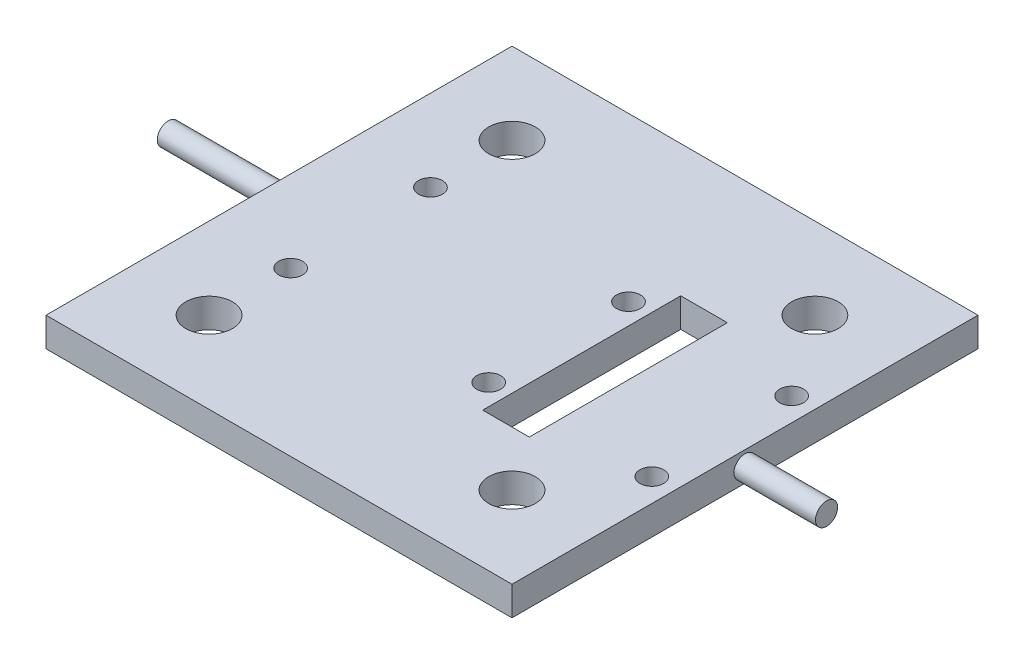
ISO-10303-21;
HEADER;
FILE_DESCRIPTION(('STEP AP214'),'2;1');
FILE_NAME('part.step','',(''),(''),'','','');
FILE_SCHEMA(('AUTOMOTIVE_DESIGN { 1 0 10303 214 1 1 1 1 }'));
ENDSEC;
DATA;
#1=APPLICATION_CONTEXT('core data for automotive mechanical design processes');
#2=APPLICATION_PROTOCOL_DEFINITION('international standard','automotive_design',2000,#1);
#3=PRODUCT_CONTEXT('',#1,'mechanical');
#4=PRODUCT('Part','Part','',(#3));
#5=PRODUCT_RELATED_PRODUCT_CATEGORY('part','',(#4));
#6=PRODUCT_DEFINITION_FORMATION('','',#4);
#7=PRODUCT_DEFINITION_CONTEXT('part definition',#1,'design');
#8=PRODUCT_DEFINITION('design','',#6,#7);
#9=PRODUCT_DEFINITION_SHAPE('','',#8);
#10=(LENGTH_UNIT() NAMED_UNIT(*) SI_UNIT(.MILLI.,.METRE.));
#11=(NAMED_UNIT(*) PLANE_ANGLE_UNIT() SI_UNIT($,.RADIAN.));
#12=(NAMED_UNIT(*) SI_UNIT($,.STERADIAN.) SOLID_ANGLE_UNIT());
#13=UNCERTAINTY_MEASURE_WITH_UNIT(LENGTH_MEASURE(1.E-05),#10,'distance_accuracy_value','');
#14=(GEOMETRIC_REPRESENTATION_CONTEXT(3) GLOBAL_UNCERTAINTY_ASSIGNED_CONTEXT((#13)) GLOBAL_UNIT_ASSIGNED_CONTEXT((#10,
#11,#12)) REPRESENTATION_CONTEXT('',''));
#15=CARTESIAN_POINT('',(0.,0.,0.));
#16=DIRECTION('',(0.,0.,1.));
#17=DIRECTION('',(1.,0.,0.));
#18=AXIS2_PLACEMENT_3D('',#15,#16,#17);
#19=CARTESIAN_POINT('',(25.4,1.5875,25.4));
#20=DIRECTION('',(-1.,0.,0.));
#21=DIRECTION('',(0.,0.,1.));
#22=AXIS2_PLACEMENT_3D('',#19,#20,#21);
#23=PLANE('',#22);
#24=CARTESIAN_POINT('',(25.4,0.,0.));
#25=DIRECTION('',(-1.,0.,0.));
#26=DIRECTION('',(0.,0.,1.));
#27=AXIS2_PLACEMENT_3D('',#24,#25,#26);
#28=CIRCLE('',#27,1.2065);
#29=CARTESIAN_POINT('',(25.4,0.,1.2065));
#30=VERTEX_POINT('',#29);
#31=EDGE_CURVE('E42',#30,#30,#28,.F.);
#32=ORIENTED_EDGE('',*,*,#31,.F.);
#33=EDGE_LOOP('',(#32));
#34=FACE_BOUND('',#33,.T.);
#35=DIRECTION('',(0.,0.,-1.));
#36=VECTOR('',#35,1.);
#37=CARTESIAN_POINT('',(25.4,-1.5875,25.4));
#38=LINE('',#37,#36);
#39=CARTESIAN_POINT('',(25.4,-1.5875,25.4));
#40=VERTEX_POINT('',#39);
#41=CARTESIAN_POINT('',(25.4,-1.5875,-25.4));
#42=VERTEX_POINT('',#41);
#43=EDGE_CURVE('E199',#40,#42,#38,.T.);
#44=ORIENTED_EDGE('',*,*,#43,.T.);
#45=DIRECTION('',(0.,-1.,0.));
#46=VECTOR('',#45,1.);
#47=CARTESIAN_POINT('',(25.4,1.5875,-25.4));
#48=LINE('',#47,#46);
#49=CARTESIAN_POINT('',(25.4,1.5875,-25.4));
#50=VERTEX_POINT('',#49);
#51=EDGE_CURVE('E226',#50,#42,#48,.T.);
#52=ORIENTED_EDGE('',*,*,#51,.F.);
#53=DIRECTION('',(0.,0.,-1.));
#54=VECTOR('',#53,1.);
#55=CARTESIAN_POINT('',(25.4,1.5875,25.4));
#56=LINE('',#55,#54);
#57=CARTESIAN_POINT('',(25.4,1.5875,25.4));
#58=VERTEX_POINT('',#57);
#59=EDGE_CURVE('E200',#58,#50,#56,.T.);
#60=ORIENTED_EDGE('',*,*,#59,.F.);
#61=DIRECTION('',(0.,-1.,0.));
#62=VECTOR('',#61,1.);
#63=CARTESIAN_POINT('',(25.4,1.5875,25.4));
#64=LINE('',#63,#62);
#65=EDGE_CURVE('E210',#58,#40,#64,.T.);
#66=ORIENTED_EDGE('',*,*,#65,.T.);
#67=EDGE_LOOP('',(#44,#52,#60,#66));
#68=FACE_BOUND('',#67,.T.);
#69=ADVANCED_FACE('F35',(#34,#68),#23,.F.);
#70=CARTESIAN_POINT('',(-25.4,1.5875,-25.4));
#71=DIRECTION('',(0.,0.,1.));
#72=DIRECTION('',(1.,0.,0.));
#73=AXIS2_PLACEMENT_3D('',#70,#71,#72);
#74=PLANE('',#73);
#75=DIRECTION('',(-1.,0.,0.));
#76=VECTOR('',#75,1.);
#77=CARTESIAN_POINT('',(-25.4,-1.5875,-25.4));
#78=LINE('',#77,#76);
#79=CARTESIAN_POINT('',(-25.4,-1.5875,-25.4));
#80=VERTEX_POINT('',#79);
#81=EDGE_CURVE('E213',#42,#80,#78,.T.);
#82=ORIENTED_EDGE('',*,*,#81,.T.);
#83=DIRECTION('',(0.,-1.,0.));
#84=VECTOR('',#83,1.);
#85=CARTESIAN_POINT('',(-25.4,1.5875,-25.4));
#86=LINE('',#85,#84);
#87=CARTESIAN_POINT('',(-25.4,1.5875,-25.4));
#88=VERTEX_POINT('',#87);
#89=EDGE_CURVE('E223',#88,#80,#86,.T.);
#90=ORIENTED_EDGE('',*,*,#89,.F.);
#91=DIRECTION('',(-1.,0.,0.));
#92=VECTOR('',#91,1.);
#93=CARTESIAN_POINT('',(-25.4,1.5875,-25.4));
#94=LINE('',#93,#92);
#95=EDGE_CURVE('E203',#50,#88,#94,.T.);
#96=ORIENTED_EDGE('',*,*,#95,.F.);
#97=ORIENTED_EDGE('',*,*,#51,.T.);
#98=EDGE_LOOP('',(#82,#90,#96,#97));
#99=FACE_BOUND('',#98,.T.);
#100=ADVANCED_FACE('F235',(#99),#74,.F.);
#101=CARTESIAN_POINT('',(-25.4,1.5875,25.4));
#102=DIRECTION('',(1.,0.,0.));
#103=DIRECTION('',(0.,0.,-1.));
#104=AXIS2_PLACEMENT_3D('',#101,#102,#103);
#105=PLANE('',#104);
#106=CARTESIAN_POINT('',(-25.4,0.,0.));
#107=DIRECTION('',(1.,0.,0.));
#108=DIRECTION('',(0.,0.,-1.));
#109=AXIS2_PLACEMENT_3D('',#106,#107,#108);
#110=CIRCLE('',#109,1.2065);
#111=CARTESIAN_POINT('',(-25.4,0.,-1.2065));
#112=VERTEX_POINT('',#111);
#113=EDGE_CURVE('E11',#112,#112,#110,.F.);
#114=ORIENTED_EDGE('',*,*,#113,.F.);
#115=EDGE_LOOP('',(#114));
#116=FACE_BOUND('',#115,.T.);
#117=DIRECTION('',(0.,0.,1.));
#118=VECTOR('',#117,1.);
#119=CARTESIAN_POINT('',(-25.4,-1.5875,25.4));
#120=LINE('',#119,#118);
#121=CARTESIAN_POINT('',(-25.4,-1.5875,25.4));
#122=VERTEX_POINT('',#121);
#123=EDGE_CURVE('E215',#80,#122,#120,.T.);
#124=ORIENTED_EDGE('',*,*,#123,.T.);
#125=DIRECTION('',(0.,-1.,0.));
#126=VECTOR('',#125,1.);
#127=CARTESIAN_POINT('',(-25.4,1.5875,25.4));
#128=LINE('',#127,#126);
#129=CARTESIAN_POINT('',(-25.4,1.5875,25.4));
#130=VERTEX_POINT('',#129);
#131=EDGE_CURVE('E220',#130,#122,#128,.T.);
#132=ORIENTED_EDGE('',*,*,#131,.F.);
#133=DIRECTION('',(0.,0.,1.));
#134=VECTOR('',#133,1.);
#135=CARTESIAN_POINT('',(-25.4,1.5875,25.4));
#136=LINE('',#135,#134);
#137=EDGE_CURVE('E206',#88,#130,#136,.T.);
#138=ORIENTED_EDGE('',*,*,#137,.F.);
#139=ORIENTED_EDGE('',*,*,#89,.T.);
#140=EDGE_LOOP('',(#124,#132,#138,#139));
#141=FACE_BOUND('',#140,.T.);
#142=ADVANCED_FACE('F253',(#116,#141),#105,.F.);
#143=CARTESIAN_POINT('',(-25.4,1.5875,25.4));
#144=DIRECTION('',(0.,0.,-1.));
#145=DIRECTION('',(-1.,0.,0.));
#146=AXIS2_PLACEMENT_3D('',#143,#144,#145);
#147=PLANE('',#146);
#148=DIRECTION('',(1.,0.,0.));
#149=VECTOR('',#148,1.);
#150=CARTESIAN_POINT('',(-25.4,-1.5875,25.4));
#151=LINE('',#150,#149);
#152=EDGE_CURVE('E204',#122,#40,#151,.T.);
#153=ORIENTED_EDGE('',*,*,#152,.T.);
#154=ORIENTED_EDGE('',*,*,#65,.F.);
#155=DIRECTION('',(1.,0.,0.));
#156=VECTOR('',#155,1.);
#157=CARTESIAN_POINT('',(-25.4,1.5875,25.4));
#158=LINE('',#157,#156);
#159=EDGE_CURVE('E208',#130,#58,#158,.T.);
#160=ORIENTED_EDGE('',*,*,#159,.F.);
#161=ORIENTED_EDGE('',*,*,#131,.T.);
#162=EDGE_LOOP('',(#153,#154,#160,#161));
#163=FACE_BOUND('',#162,.T.);
#164=ADVANCED_FACE('F251',(#163),#147,.F.);
#165=CARTESIAN_POINT('',(0.,1.5875,0.));
#166=DIRECTION('',(0.,-1.,0.));
#167=DIRECTION('',(0.,0.,-1.));
#168=AXIS2_PLACEMENT_3D('',#165,#166,#167);
#169=PLANE('',#168);
#170=DIRECTION('',(1.,0.,0.));
#171=VECTOR('',#170,1.);
#172=CARTESIAN_POINT('',(12.446,1.5875,10.5627941426654));
#173=LINE('',#172,#171);
#174=CARTESIAN_POINT('',(7.36599999999999,1.5875,10.5627941426654));
#175=VERTEX_POINT('',#174);
#176=CARTESIAN_POINT('',(12.446,1.5875,10.5627941426654));
#177=VERTEX_POINT('',#176);
#178=EDGE_CURVE('E118',#175,#177,#173,.T.);
#179=ORIENTED_EDGE('',*,*,#178,.F.);
#180=DIRECTION('',(0.,0.,1.));
#181=VECTOR('',#180,1.);
#182=CARTESIAN_POINT('',(7.36599999999999,1.5875,10.5627941426654));
#183=LINE('',#182,#181);
#184=CARTESIAN_POINT('',(7.36599999999999,1.5875,-11.0272058573346));
#185=VERTEX_POINT('',#184);
#186=EDGE_CURVE('E49',#185,#175,#183,.T.);
#187=ORIENTED_EDGE('',*,*,#186,.F.);
#188=DIRECTION('',(-1.,0.,0.));
#189=VECTOR('',#188,1.);
#190=CARTESIAN_POINT('',(12.446,1.5875,-11.0272058573346));
#191=LINE('',#190,#189);
#192=CARTESIAN_POINT('',(12.446,1.5875,-11.0272058573346));
#193=VERTEX_POINT('',#192);
#194=EDGE_CURVE('E111',#193,#185,#191,.T.);
#195=ORIENTED_EDGE('',*,*,#194,.F.);
#196=DIRECTION('',(0.,0.,-1.));
#197=VECTOR('',#196,1.);
#198=CARTESIAN_POINT('',(12.446,1.5875,10.5627941426654));
#199=LINE('',#198,#197);
#200=EDGE_CURVE('E125',#177,#193,#199,.T.);
#201=ORIENTED_EDGE('',*,*,#200,.F.);
#202=EDGE_LOOP('',(#179,#187,#195,#201));
#203=FACE_BOUND('',#202,.T.);
#204=CARTESIAN_POINT('',(-16.51,1.5875,7.62));
#205=DIRECTION('',(0.,1.,0.));
#206=DIRECTION('',(0.,0.,1.));
#207=AXIS2_PLACEMENT_3D('',#204,#205,#206);
#208=CIRCLE('',#207,1.3);
#209=CARTESIAN_POINT('',(-16.51,1.5875,8.92));
#210=VERTEX_POINT('',#209);
#211=EDGE_CURVE('E105',#210,#210,#208,.T.);
#212=ORIENTED_EDGE('',*,*,#211,.F.);
#213=EDGE_LOOP('',(#212));
#214=FACE_BOUND('',#213,.T.);
#215=CARTESIAN_POINT('',(-16.51,1.5875,-7.62));
#216=DIRECTION('',(0.,1.,0.));
#217=DIRECTION('',(0.,0.,1.));
#218=AXIS2_PLACEMENT_3D('',#215,#216,#217);
#219=CIRCLE('',#218,1.3);
#220=CARTESIAN_POINT('',(-16.51,1.5875,-6.32));
#221=VERTEX_POINT('',#220);
#222=EDGE_CURVE('E139',#221,#221,#219,.T.);
#223=ORIENTED_EDGE('',*,*,#222,.F.);
#224=EDGE_LOOP('',(#223));
#225=FACE_BOUND('',#224,.T.);
#226=CARTESIAN_POINT('',(5.08000000000001,1.5875,7.62));
#227=DIRECTION('',(0.,1.,0.));
#228=DIRECTION('',(0.,0.,1.));
#229=AXIS2_PLACEMENT_3D('',#226,#227,#228);
#230=CIRCLE('',#229,1.3);
#231=CARTESIAN_POINT('',(5.08000000000001,1.5875,8.92));
#232=VERTEX_POINT('',#231);
#233=EDGE_CURVE('E145',#232,#232,#230,.T.);
#234=ORIENTED_EDGE('',*,*,#233,.F.);
#235=EDGE_LOOP('',(#234));
#236=FACE_BOUND('',#235,.T.);
#237=CARTESIAN_POINT('',(5.08000000000001,1.5875,-7.62));
#238=DIRECTION('',(0.,1.,0.));
#239=DIRECTION('',(0.,0.,1.));
#240=AXIS2_PLACEMENT_3D('',#237,#238,#239);
#241=CIRCLE('',#240,1.3);
#242=CARTESIAN_POINT('',(5.08000000000001,1.5875,-6.32));
#243=VERTEX_POINT('',#242);
#244=EDGE_CURVE('E151',#243,#243,#241,.T.);
#245=ORIENTED_EDGE('',*,*,#244,.F.);
#246=EDGE_LOOP('',(#245));
#247=FACE_BOUND('',#246,.T.);
#248=CARTESIAN_POINT('',(22.86,1.5875,-7.62));
#249=DIRECTION('',(0.,1.,0.));
#250=DIRECTION('',(0.,0.,1.));
#251=AXIS2_PLACEMENT_3D('',#248,#249,#250);
#252=CIRCLE('',#251,1.3);
#253=CARTESIAN_POINT('',(22.86,1.5875,-6.32));
#254=VERTEX_POINT('',#253);
#255=EDGE_CURVE('E157',#254,#254,#252,.T.);
#256=ORIENTED_EDGE('',*,*,#255,.F.);
#257=EDGE_LOOP('',(#256));
#258=FACE_BOUND('',#257,.T.);
#259=CARTESIAN_POINT('',(22.86,1.5875,7.62));
#260=DIRECTION('',(0.,1.,0.));
#261=DIRECTION('',(0.,0.,1.));
#262=AXIS2_PLACEMENT_3D('',#259,#260,#261);
#263=CIRCLE('',#262,1.3);
#264=CARTESIAN_POINT('',(22.86,1.5875,8.92));
#265=VERTEX_POINT('',#264);
#266=EDGE_CURVE('E163',#265,#265,#263,.T.);
#267=ORIENTED_EDGE('',*,*,#266,.F.);
#268=EDGE_LOOP('',(#267));
#269=FACE_BOUND('',#268,.T.);
#270=CARTESIAN_POINT('',(-16.51,1.5875,16.51));
#271=DIRECTION('',(0.,1.,0.));
#272=DIRECTION('',(0.,0.,1.));
#273=AXIS2_PLACEMENT_3D('',#270,#271,#272);
#274=CIRCLE('',#273,2.54);
#275=CARTESIAN_POINT('',(-16.51,1.5875,19.05));
#276=VERTEX_POINT('',#275);
#277=EDGE_CURVE('E172',#276,#276,#274,.T.);
#278=ORIENTED_EDGE('',*,*,#277,.F.);
#279=EDGE_LOOP('',(#278));
#280=FACE_BOUND('',#279,.T.);
#281=CARTESIAN_POINT('',(16.51,1.5875,16.51));
#282=DIRECTION('',(0.,1.,0.));
#283=DIRECTION('',(0.,0.,1.));
#284=AXIS2_PLACEMENT_3D('',#281,#282,#283);
#285=CIRCLE('',#284,2.54);
#286=CARTESIAN_POINT('',(16.51,1.5875,19.05));
#287=VERTEX_POINT('',#286);
#288=EDGE_CURVE('E183',#287,#287,#285,.T.);
#289=ORIENTED_EDGE('',*,*,#288,.F.);
#290=EDGE_LOOP('',(#289));
#291=FACE_BOUND('',#290,.T.);
#292=CARTESIAN_POINT('',(16.51,1.5875,-16.51));
#293=DIRECTION('',(0.,1.,0.));
#294=DIRECTION('',(0.,0.,1.));
#295=AXIS2_PLACEMENT_3D('',#292,#293,#294);
#296=CIRCLE('',#295,2.54);
#297=CARTESIAN_POINT('',(16.51,1.5875,-13.97));
#298=VERTEX_POINT('',#297);
#299=EDGE_CURVE('E177',#298,#298,#296,.T.);
#300=ORIENTED_EDGE('',*,*,#299,.F.);
#301=EDGE_LOOP('',(#300));
#302=FACE_BOUND('',#301,.T.);
#303=CARTESIAN_POINT('',(-16.51,1.5875,-16.51));
#304=DIRECTION('',(0.,1.,0.));
#305=DIRECTION('',(0.,0.,1.));
#306=AXIS2_PLACEMENT_3D('',#303,#304,#305);
#307=CIRCLE('',#306,2.54);
#308=CARTESIAN_POINT('',(-16.51,1.5875,-13.97));
#309=VERTEX_POINT('',#308);
#310=EDGE_CURVE('E176',#309,#309,#307,.T.);
#311=ORIENTED_EDGE('',*,*,#310,.F.);
#312=EDGE_LOOP('',(#311));
#313=FACE_BOUND('',#312,.T.);
#314=ORIENTED_EDGE('',*,*,#59,.T.);
#315=ORIENTED_EDGE('',*,*,#95,.T.);
#316=ORIENTED_EDGE('',*,*,#137,.T.);
#317=ORIENTED_EDGE('',*,*,#159,.T.);
#318=EDGE_LOOP('',(#314,#315,#316,#317));
#319=FACE_BOUND('',#318,.T.);
#320=ADVANCED_FACE('F247',(#203,#214,#225,#236,#247,#258,#269,#280,#291,#302,#313,#319),#169,.F.);
#321=CARTESIAN_POINT('',(0.,-1.5875,0.));
#322=DIRECTION('',(0.,-1.,0.));
#323=DIRECTION('',(0.,0.,-1.));
#324=AXIS2_PLACEMENT_3D('',#321,#322,#323);
#325=PLANE('',#324);
#326=DIRECTION('',(0.,0.,1.));
#327=VECTOR('',#326,1.);
#328=CARTESIAN_POINT('',(7.36599999999999,-1.5875,10.5627941426654));
#329=LINE('',#328,#327);
#330=CARTESIAN_POINT('',(7.36599999999999,-1.5875,-11.0272058573346));
#331=VERTEX_POINT('',#330);
#332=CARTESIAN_POINT('',(7.36599999999999,-1.5875,10.5627941426654));
#333=VERTEX_POINT('',#332);
#334=EDGE_CURVE('E109',#331,#333,#329,.T.);
#335=ORIENTED_EDGE('',*,*,#334,.T.);
#336=DIRECTION('',(1.,0.,0.));
#337=VECTOR('',#336,1.);
#338=CARTESIAN_POINT('',(12.446,-1.5875,10.5627941426654));
#339=LINE('',#338,#337);
#340=CARTESIAN_POINT('',(12.446,-1.5875,10.5627941426654));
#341=VERTEX_POINT('',#340);
#342=EDGE_CURVE('E98',#333,#341,#339,.T.);
#343=ORIENTED_EDGE('',*,*,#342,.T.);
#344=DIRECTION('',(0.,0.,-1.));
#345=VECTOR('',#344,1.);
#346=CARTESIAN_POINT('',(12.446,-1.5875,10.5627941426654));
#347=LINE('',#346,#345);
#348=CARTESIAN_POINT('',(12.446,-1.5875,-11.0272058573346));
#349=VERTEX_POINT('',#348);
#350=EDGE_CURVE('E120',#341,#349,#347,.T.);
#351=ORIENTED_EDGE('',*,*,#350,.T.);
#352=DIRECTION('',(-1.,0.,0.));
#353=VECTOR('',#352,1.);
#354=CARTESIAN_POINT('',(12.446,-1.5875,-11.0272058573346));
#355=LINE('',#354,#353);
#356=EDGE_CURVE('E116',#349,#331,#355,.T.);
#357=ORIENTED_EDGE('',*,*,#356,.T.);
#358=EDGE_LOOP('',(#335,#343,#351,#357));
#359=FACE_BOUND('',#358,.T.);
#360=CARTESIAN_POINT('',(-16.51,-1.5875,7.62));
#361=DIRECTION('',(0.,1.,0.));
#362=DIRECTION('',(0.,0.,1.));
#363=AXIS2_PLACEMENT_3D('',#360,#361,#362);
#364=CIRCLE('',#363,1.3);
#365=CARTESIAN_POINT('',(-16.51,-1.5875,8.92));
#366=VERTEX_POINT('',#365);
#367=EDGE_CURVE('E136',#366,#366,#364,.T.);
#368=ORIENTED_EDGE('',*,*,#367,.T.);
#369=EDGE_LOOP('',(#368));
#370=FACE_BOUND('',#369,.T.);
#371=CARTESIAN_POINT('',(-16.51,-1.5875,-7.62));
#372=DIRECTION('',(0.,1.,0.));
#373=DIRECTION('',(0.,0.,1.));
#374=AXIS2_PLACEMENT_3D('',#371,#372,#373);
#375=CIRCLE('',#374,1.3);
#376=CARTESIAN_POINT('',(-16.51,-1.5875,-6.32));
#377=VERTEX_POINT('',#376);
#378=EDGE_CURVE('E142',#377,#377,#375,.T.);
#379=ORIENTED_EDGE('',*,*,#378,.T.);
#380=EDGE_LOOP('',(#379));
#381=FACE_BOUND('',#380,.T.);
#382=CARTESIAN_POINT('',(5.08000000000001,-1.5875,7.62));
#383=DIRECTION('',(0.,1.,0.));
#384=DIRECTION('',(0.,0.,1.));
#385=AXIS2_PLACEMENT_3D('',#382,#383,#384);
#386=CIRCLE('',#385,1.3);
#387=CARTESIAN_POINT('',(5.08000000000001,-1.5875,8.92));
#388=VERTEX_POINT('',#387);
#389=EDGE_CURVE('E148',#388,#388,#386,.T.);
#390=ORIENTED_EDGE('',*,*,#389,.T.);
#391=EDGE_LOOP('',(#390));
#392=FACE_BOUND('',#391,.T.);
#393=CARTESIAN_POINT('',(5.08000000000001,-1.5875,-7.62));
#394=DIRECTION('',(0.,1.,0.));
#395=DIRECTION('',(0.,0.,1.));
#396=AXIS2_PLACEMENT_3D('',#393,#394,#395);
#397=CIRCLE('',#396,1.3);
#398=CARTESIAN_POINT('',(5.08000000000001,-1.5875,-6.32));
#399=VERTEX_POINT('',#398);
#400=EDGE_CURVE('E154',#399,#399,#397,.T.);
#401=ORIENTED_EDGE('',*,*,#400,.T.);
#402=EDGE_LOOP('',(#401));
#403=FACE_BOUND('',#402,.T.);
#404=CARTESIAN_POINT('',(22.86,-1.5875,-7.62));
#405=DIRECTION('',(0.,1.,0.));
#406=DIRECTION('',(0.,0.,1.));
#407=AXIS2_PLACEMENT_3D('',#404,#405,#406);
#408=CIRCLE('',#407,1.3);
#409=CARTESIAN_POINT('',(22.86,-1.5875,-6.32));
#410=VERTEX_POINT('',#409);
#411=EDGE_CURVE('E160',#410,#410,#408,.T.);
#412=ORIENTED_EDGE('',*,*,#411,.T.);
#413=EDGE_LOOP('',(#412));
#414=FACE_BOUND('',#413,.T.);
#415=CARTESIAN_POINT('',(22.86,-1.5875,7.62));
#416=DIRECTION('',(0.,1.,0.));
#417=DIRECTION('',(0.,0.,1.));
#418=AXIS2_PLACEMENT_3D('',#415,#416,#417);
#419=CIRCLE('',#418,1.3);
#420=CARTESIAN_POINT('',(22.86,-1.5875,8.92));
#421=VERTEX_POINT('',#420);
#422=EDGE_CURVE('E166',#421,#421,#419,.T.);
#423=ORIENTED_EDGE('',*,*,#422,.T.);
#424=EDGE_LOOP('',(#423));
#425=FACE_BOUND('',#424,.T.);
#426=CARTESIAN_POINT('',(-16.51,-1.5875,16.51));
#427=DIRECTION('',(0.,1.,0.));
#428=DIRECTION('',(0.,0.,1.));
#429=AXIS2_PLACEMENT_3D('',#426,#427,#428);
#430=CIRCLE('',#429,2.54);
#431=CARTESIAN_POINT('',(-16.51,-1.5875,19.05));
#432=VERTEX_POINT('',#431);
#433=EDGE_CURVE('E186',#432,#432,#430,.T.);
#434=ORIENTED_EDGE('',*,*,#433,.T.);
#435=EDGE_LOOP('',(#434));
#436=FACE_BOUND('',#435,.T.);
#437=CARTESIAN_POINT('',(16.51,-1.5875,16.51));
#438=DIRECTION('',(0.,1.,0.));
#439=DIRECTION('',(0.,0.,1.));
#440=AXIS2_PLACEMENT_3D('',#437,#438,#439);
#441=CIRCLE('',#440,2.54);
#442=CARTESIAN_POINT('',(16.51,-1.5875,19.05));
#443=VERTEX_POINT('',#442);
#444=EDGE_CURVE('E180',#443,#443,#441,.T.);
#445=ORIENTED_EDGE('',*,*,#444,.T.);
#446=EDGE_LOOP('',(#445));
#447=FACE_BOUND('',#446,.T.);
#448=CARTESIAN_POINT('',(16.51,-1.5875,-16.51));
#449=DIRECTION('',(0.,1.,0.));
#450=DIRECTION('',(0.,0.,1.));
#451=AXIS2_PLACEMENT_3D('',#448,#449,#450);
#452=CIRCLE('',#451,2.54);
#453=CARTESIAN_POINT('',(16.51,-1.5875,-13.97));
#454=VERTEX_POINT('',#453);
#455=EDGE_CURVE('E173',#454,#454,#452,.T.);
#456=ORIENTED_EDGE('',*,*,#455,.T.);
#457=EDGE_LOOP('',(#456));
#458=FACE_BOUND('',#457,.T.);
#459=CARTESIAN_POINT('',(-16.51,-1.5875,-16.51));
#460=DIRECTION('',(0.,1.,0.));
#461=DIRECTION('',(0.,0.,1.));
#462=AXIS2_PLACEMENT_3D('',#459,#460,#461);
#463=CIRCLE('',#462,2.54);
#464=CARTESIAN_POINT('',(-16.51,-1.5875,-13.97));
#465=VERTEX_POINT('',#464);
#466=EDGE_CURVE('E191',#465,#465,#463,.T.);
#467=ORIENTED_EDGE('',*,*,#466,.T.);
#468=EDGE_LOOP('',(#467));
#469=FACE_BOUND('',#468,.T.);
#470=ORIENTED_EDGE('',*,*,#43,.F.);
#471=ORIENTED_EDGE('',*,*,#152,.F.);
#472=ORIENTED_EDGE('',*,*,#123,.F.);
#473=ORIENTED_EDGE('',*,*,#81,.F.);
#474=EDGE_LOOP('',(#470,#471,#472,#473));
#475=FACE_BOUND('',#474,.T.);
#476=ADVANCED_FACE('F114',(#359,#370,#381,#392,#403,#414,#425,#436,#447,#458,#469,#475),#325,.T.);
#477=CARTESIAN_POINT('',(34.29,0.,0.));
#478=DIRECTION('',(-1.,0.,0.));
#479=DIRECTION('',(0.,0.,1.));
#480=AXIS2_PLACEMENT_3D('',#477,#478,#479);
#481=CYLINDRICAL_SURFACE('',#480,1.2065);
#482=CARTESIAN_POINT('',(34.29,0.,0.));
#483=DIRECTION('',(1.,0.,0.));
#484=DIRECTION('',(0.,0.,-1.));
#485=AXIS2_PLACEMENT_3D('',#482,#483,#484);
#486=CIRCLE('',#485,1.2065);
#487=CARTESIAN_POINT('',(34.29,0.,-1.2065));
#488=VERTEX_POINT('',#487);
#489=EDGE_CURVE('E194',#488,#488,#486,.T.);
#490=ORIENTED_EDGE('',*,*,#489,.F.);
#491=EDGE_LOOP('',(#490));
#492=FACE_BOUND('',#491,.T.);
#493=ORIENTED_EDGE('',*,*,#31,.T.);
#494=EDGE_LOOP('',(#493));
#495=FACE_BOUND('',#494,.T.);
#496=ADVANCED_FACE('F231',(#492,#495),#481,.T.);
#497=CARTESIAN_POINT('',(34.29,0.,0.));
#498=DIRECTION('',(1.,0.,0.));
#499=DIRECTION('',(0.,0.,-1.));
#500=AXIS2_PLACEMENT_3D('',#497,#498,#499);
#501=PLANE('',#500);
#502=ORIENTED_EDGE('',*,*,#489,.T.);
#503=EDGE_LOOP('',(#502));
#504=FACE_BOUND('',#503,.T.);
#505=ADVANCED_FACE('F271',(#504),#501,.T.);
#506=CARTESIAN_POINT('',(-16.51,-1.5875,-16.51));
#507=DIRECTION('',(0.,1.,0.));
#508=DIRECTION('',(0.,0.,1.));
#509=AXIS2_PLACEMENT_3D('',#506,#507,#508);
#510=CYLINDRICAL_SURFACE('',#509,2.54);
#511=ORIENTED_EDGE('',*,*,#466,.F.);
#512=EDGE_LOOP('',(#511));
#513=FACE_BOUND('',#512,.T.);
#514=ORIENTED_EDGE('',*,*,#310,.T.);
#515=EDGE_LOOP('',(#514));
#516=FACE_BOUND('',#515,.T.);
#517=ADVANCED_FACE('F275',(#513,#516),#510,.F.);
#518=CARTESIAN_POINT('',(16.51,-1.5875,-16.51));
#519=DIRECTION('',(0.,1.,0.));
#520=DIRECTION('',(0.,0.,1.));
#521=AXIS2_PLACEMENT_3D('',#518,#519,#520);
#522=CYLINDRICAL_SURFACE('',#521,2.54);
#523=ORIENTED_EDGE('',*,*,#455,.F.);
#524=EDGE_LOOP('',(#523));
#525=FACE_BOUND('',#524,.T.);
#526=ORIENTED_EDGE('',*,*,#299,.T.);
#527=EDGE_LOOP('',(#526));
#528=FACE_BOUND('',#527,.T.);
#529=ADVANCED_FACE('F279',(#525,#528),#522,.F.);
#530=CARTESIAN_POINT('',(16.51,-1.5875,16.51));
#531=DIRECTION('',(0.,1.,0.));
#532=DIRECTION('',(0.,0.,1.));
#533=AXIS2_PLACEMENT_3D('',#530,#531,#532);
#534=CYLINDRICAL_SURFACE('',#533,2.54);
#535=ORIENTED_EDGE('',*,*,#444,.F.);
#536=EDGE_LOOP('',(#535));
#537=FACE_BOUND('',#536,.T.);
#538=ORIENTED_EDGE('',*,*,#288,.T.);
#539=EDGE_LOOP('',(#538));
#540=FACE_BOUND('',#539,.T.);
#541=ADVANCED_FACE('F285',(#537,#540),#534,.F.);
#542=CARTESIAN_POINT('',(-16.51,-1.5875,16.51));
#543=DIRECTION('',(0.,1.,0.));
#544=DIRECTION('',(0.,0.,1.));
#545=AXIS2_PLACEMENT_3D('',#542,#543,#544);
#546=CYLINDRICAL_SURFACE('',#545,2.54);
#547=ORIENTED_EDGE('',*,*,#433,.F.);
#548=EDGE_LOOP('',(#547));
#549=FACE_BOUND('',#548,.T.);
#550=ORIENTED_EDGE('',*,*,#277,.T.);
#551=EDGE_LOOP('',(#550));
#552=FACE_BOUND('',#551,.T.);
#553=ADVANCED_FACE('F281',(#549,#552),#546,.F.);
#554=CARTESIAN_POINT('',(-37.465,0.,0.));
#555=DIRECTION('',(1.,0.,0.));
#556=DIRECTION('',(0.,0.,-1.));
#557=AXIS2_PLACEMENT_3D('',#554,#555,#556);
#558=CYLINDRICAL_SURFACE('',#557,1.2065);
#559=CARTESIAN_POINT('',(-37.465,0.,0.));
#560=DIRECTION('',(-1.,0.,0.));
#561=DIRECTION('',(0.,0.,1.));
#562=AXIS2_PLACEMENT_3D('',#559,#560,#561);
#563=CIRCLE('',#562,1.2065);
#564=CARTESIAN_POINT('',(-37.465,0.,-1.2065));
#565=VERTEX_POINT('',#564);
#566=EDGE_CURVE('E169',#565,#565,#563,.T.);
#567=CARTESIAN_POINT('',(-37.465,0.,-1.2065));
#568=CARTESIAN_POINT('',(-37.3393229166667,0.,-1.2065));
#569=CARTESIAN_POINT('',(-37.2136458333333,0.,-1.2065));
#570=CARTESIAN_POINT('',(-36.9622916666667,0.,-1.2065));
#571=CARTESIAN_POINT('',(-36.8366145833333,0.,-1.2065));
#572=CARTESIAN_POINT('',(-36.5852604166667,0.,-1.2065));
#573=CARTESIAN_POINT('',(-36.4595833333333,0.,-1.2065));
#574=CARTESIAN_POINT('',(-36.2082291666667,0.,-1.2065));
#575=CARTESIAN_POINT('',(-36.0825520833333,0.,-1.2065));
#576=CARTESIAN_POINT('',(-35.8311979166667,0.,-1.2065));
#577=CARTESIAN_POINT('',(-35.7055208333333,0.,-1.2065));
#578=CARTESIAN_POINT('',(-35.4541666666667,0.,-1.2065));
#579=CARTESIAN_POINT('',(-35.3284895833333,0.,-1.2065));
#580=CARTESIAN_POINT('',(-35.0771354166667,0.,-1.2065));
#581=CARTESIAN_POINT('',(-34.9514583333333,0.,-1.2065));
#582=CARTESIAN_POINT('',(-34.7001041666667,0.,-1.2065));
#583=CARTESIAN_POINT('',(-34.5744270833333,0.,-1.2065));
#584=CARTESIAN_POINT('',(-34.3230729166667,0.,-1.2065));
#585=CARTESIAN_POINT('',(-34.1973958333333,0.,-1.2065));
#586=CARTESIAN_POINT('',(-33.9460416666667,0.,-1.2065));
#587=CARTESIAN_POINT('',(-33.8203645833333,0.,-1.2065));
#588=CARTESIAN_POINT('',(-33.5690104166667,0.,-1.2065));
#589=CARTESIAN_POINT('',(-33.4433333333333,0.,-1.2065));
#590=CARTESIAN_POINT('',(-33.1919791666667,0.,-1.2065));
#591=CARTESIAN_POINT('',(-33.0663020833333,0.,-1.2065));
#592=CARTESIAN_POINT('',(-32.8149479166667,0.,-1.2065));
#593=CARTESIAN_POINT('',(-32.6892708333333,0.,-1.2065));
#594=CARTESIAN_POINT('',(-32.4379166666667,0.,-1.2065));
#595=CARTESIAN_POINT('',(-32.3122395833333,0.,-1.2065));
#596=CARTESIAN_POINT('',(-32.0608854166667,0.,-1.2065));
#597=CARTESIAN_POINT('',(-31.9352083333333,0.,-1.2065));
#598=CARTESIAN_POINT('',(-31.6838541666667,0.,-1.2065));
#599=CARTESIAN_POINT('',(-31.5581770833333,0.,-1.2065));
#600=CARTESIAN_POINT('',(-31.3068229166667,0.,-1.2065));
#601=CARTESIAN_POINT('',(-31.1811458333333,0.,-1.2065));
#602=CARTESIAN_POINT('',(-30.9297916666667,0.,-1.2065));
#603=CARTESIAN_POINT('',(-30.8041145833333,0.,-1.2065));
#604=CARTESIAN_POINT('',(-30.5527604166667,0.,-1.2065));
#605=CARTESIAN_POINT('',(-30.4270833333333,0.,-1.2065));
#606=CARTESIAN_POINT('',(-30.1757291666667,0.,-1.2065));
#607=CARTESIAN_POINT('',(-30.0500520833333,0.,-1.2065));
#608=CARTESIAN_POINT('',(-29.7986979166667,0.,-1.2065));
#609=CARTESIAN_POINT('',(-29.6730208333333,0.,-1.2065));
#610=CARTESIAN_POINT('',(-29.4216666666667,0.,-1.2065));
#611=CARTESIAN_POINT('',(-29.2959895833333,0.,-1.2065));
#612=CARTESIAN_POINT('',(-29.0446354166667,0.,-1.2065));
#613=CARTESIAN_POINT('',(-28.9189583333333,0.,-1.2065));
#614=CARTESIAN_POINT('',(-28.6676041666667,0.,-1.2065));
#615=CARTESIAN_POINT('',(-28.5419270833333,0.,-1.2065));
#616=CARTESIAN_POINT('',(-28.2905729166667,0.,-1.2065));
#617=CARTESIAN_POINT('',(-28.1648958333333,0.,-1.2065));
#618=CARTESIAN_POINT('',(-27.9135416666667,0.,-1.2065));
#619=CARTESIAN_POINT('',(-27.7878645833333,0.,-1.2065));
#620=CARTESIAN_POINT('',(-27.5365104166667,0.,-1.2065));
#621=CARTESIAN_POINT('',(-27.4108333333333,0.,-1.2065));
#622=CARTESIAN_POINT('',(-27.1594791666667,0.,-1.2065));
#623=CARTESIAN_POINT('',(-27.0338020833333,0.,-1.2065));
#624=CARTESIAN_POINT('',(-26.7824479166667,0.,-1.2065));
#625=CARTESIAN_POINT('',(-26.6567708333333,0.,-1.2065));
#626=CARTESIAN_POINT('',(-26.4054166666667,0.,-1.2065));
#627=CARTESIAN_POINT('',(-26.2797395833333,0.,-1.2065));
#628=CARTESIAN_POINT('',(-26.0283854166667,0.,-1.2065));
#629=CARTESIAN_POINT('',(-25.9027083333333,0.,-1.2065));
#630=CARTESIAN_POINT('',(-25.6513541666667,0.,-1.2065));
#631=CARTESIAN_POINT('',(-25.5256770833333,0.,-1.2065));
#632=CARTESIAN_POINT('',(-25.4,0.,-1.2065));
#633=B_SPLINE_CURVE_WITH_KNOTS('',3,(#567,#568,#569,#570,#571,#572,#573,#574,#575,#576,#577,
#578,#579,#580,#581,#582,#583,#584,#585,#586,#587,#588,#589,#590,#591,#592,#593,#594,#595,#596,
#597,#598,#599,#600,#601,#602,#603,#604,#605,#606,#607,#608,#609,#610,#611,#612,#613,#614,#615,
#616,#617,#618,#619,#620,#621,#622,#623,#624,#625,#626,#627,#628,#629,#630,#631,#632),
.UNSPECIFIED.,.F.,.F.,(4,2,2,2,2,2,2,2,2,2,2,2,2,2,2,2,2,2,2,2,2,2,2,2,2,2,2,2,2,2,2,2,4),(0.,
0.377031250000007,0.754062500000007,1.13109375000001,1.50812500000001,1.88515625000001,
2.26218750000001,2.63921875000001,3.01625000000001,3.39328125,3.7703125,4.14734375,4.524375,
4.90140625,5.2784375,5.65546875,6.0325,6.40953125,6.7865625,7.16359375,7.540625,7.91765625,
8.2946875,8.67171875,9.04875,9.42578125,9.8028125,10.17984375,10.556875,10.93390625,11.3109375,
11.68796875,12.065),.UNSPECIFIED.);
#634=EDGE_CURVE('BSEAM284',#565,#112,#633,.T.);
#635=ORIENTED_EDGE('',*,*,#566,.F.);
#636=ORIENTED_EDGE('',*,*,#113,.T.);
#637=ORIENTED_EDGE('',*,*,#634,.T.);
#638=ORIENTED_EDGE('',*,*,#634,.F.);
#639=EDGE_LOOP('',(#635,#637,#636,#638));
#640=FACE_BOUND('',#639,.T.);
#641=ADVANCED_FACE('F284',(#640),#558,.T.);
#642=CARTESIAN_POINT('',(-37.465,0.,0.));
#643=DIRECTION('',(-1.,0.,0.));
#644=DIRECTION('',(0.,0.,1.));
#645=AXIS2_PLACEMENT_3D('',#642,#643,#644);
#646=PLANE('',#645);
#647=ORIENTED_EDGE('',*,*,#566,.T.);
#648=EDGE_LOOP('',(#647));
#649=FACE_BOUND('',#648,.T.);
#650=ADVANCED_FACE('F295',(#649),#646,.T.);
#651=CARTESIAN_POINT('',(22.86,1.5875,7.62));
#652=DIRECTION('',(0.,1.,0.));
#653=DIRECTION('',(0.,0.,1.));
#654=AXIS2_PLACEMENT_3D('',#651,#652,#653);
#655=CYLINDRICAL_SURFACE('',#654,1.3);
#656=ORIENTED_EDGE('',*,*,#422,.F.);
#657=EDGE_LOOP('',(#656));
#658=FACE_BOUND('',#657,.T.);
#659=ORIENTED_EDGE('',*,*,#266,.T.);
#660=EDGE_LOOP('',(#659));
#661=FACE_BOUND('',#660,.T.);
#662=ADVANCED_FACE('F299',(#658,#661),#655,.F.);
#663=CARTESIAN_POINT('',(22.86,1.5875,-7.62));
#664=DIRECTION('',(0.,1.,0.));
#665=DIRECTION('',(0.,0.,1.));
#666=AXIS2_PLACEMENT_3D('',#663,#664,#665);
#667=CYLINDRICAL_SURFACE('',#666,1.3);
#668=ORIENTED_EDGE('',*,*,#411,.F.);
#669=EDGE_LOOP('',(#668));
#670=FACE_BOUND('',#669,.T.);
#671=ORIENTED_EDGE('',*,*,#255,.T.);
#672=EDGE_LOOP('',(#671));
#673=FACE_BOUND('',#672,.T.);
#674=ADVANCED_FACE('F303',(#670,#673),#667,.F.);
#675=CARTESIAN_POINT('',(5.08000000000001,1.5875,-7.62));
#676=DIRECTION('',(0.,1.,0.));
#677=DIRECTION('',(0.,0.,1.));
#678=AXIS2_PLACEMENT_3D('',#675,#676,#677);
#679=CYLINDRICAL_SURFACE('',#678,1.3);
#680=ORIENTED_EDGE('',*,*,#400,.F.);
#681=EDGE_LOOP('',(#680));
#682=FACE_BOUND('',#681,.T.);
#683=ORIENTED_EDGE('',*,*,#244,.T.);
#684=EDGE_LOOP('',(#683));
#685=FACE_BOUND('',#684,.T.);
#686=ADVANCED_FACE('F307',(#682,#685),#679,.F.);
#687=CARTESIAN_POINT('',(5.08000000000001,1.5875,7.62));
#688=DIRECTION('',(0.,1.,0.));
#689=DIRECTION('',(0.,0.,1.));
#690=AXIS2_PLACEMENT_3D('',#687,#688,#689);
#691=CYLINDRICAL_SURFACE('',#690,1.3);
#692=ORIENTED_EDGE('',*,*,#389,.F.);
#693=EDGE_LOOP('',(#692));
#694=FACE_BOUND('',#693,.T.);
#695=ORIENTED_EDGE('',*,*,#233,.T.);
#696=EDGE_LOOP('',(#695));
#697=FACE_BOUND('',#696,.T.);
#698=ADVANCED_FACE('F311',(#694,#697),#691,.F.);
#699=CARTESIAN_POINT('',(-16.51,1.5875,-7.62));
#700=DIRECTION('',(0.,1.,0.));
#701=DIRECTION('',(0.,0.,1.));
#702=AXIS2_PLACEMENT_3D('',#699,#700,#701);
#703=CYLINDRICAL_SURFACE('',#702,1.3);
#704=ORIENTED_EDGE('',*,*,#378,.F.);
#705=EDGE_LOOP('',(#704));
#706=FACE_BOUND('',#705,.T.);
#707=ORIENTED_EDGE('',*,*,#222,.T.);
#708=EDGE_LOOP('',(#707));
#709=FACE_BOUND('',#708,.T.);
#710=ADVANCED_FACE('F315',(#706,#709),#703,.F.);
#711=CARTESIAN_POINT('',(-16.51,1.5875,7.62));
#712=DIRECTION('',(0.,1.,0.));
#713=DIRECTION('',(0.,0.,1.));
#714=AXIS2_PLACEMENT_3D('',#711,#712,#713);
#715=CYLINDRICAL_SURFACE('',#714,1.3);
#716=ORIENTED_EDGE('',*,*,#367,.F.);
#717=EDGE_LOOP('',(#716));
#718=FACE_BOUND('',#717,.T.);
#719=ORIENTED_EDGE('',*,*,#211,.T.);
#720=EDGE_LOOP('',(#719));
#721=FACE_BOUND('',#720,.T.);
#722=ADVANCED_FACE('F319',(#718,#721),#715,.F.);
#723=CARTESIAN_POINT('',(7.36599999999999,-1.5885,10.5627941426654));
#724=DIRECTION('',(-1.,0.,0.));
#725=DIRECTION('',(0.,0.,1.));
#726=AXIS2_PLACEMENT_3D('',#723,#724,#725);
#727=PLANE('',#726);
#728=DIRECTION('',(0.,1.,0.));
#729=VECTOR('',#728,1.);
#730=CARTESIAN_POINT('',(7.36599999999999,-1.5885,-11.0272058573346));
#731=LINE('',#730,#729);
#732=EDGE_CURVE('E106',#331,#185,#731,.T.);
#733=ORIENTED_EDGE('',*,*,#732,.T.);
#734=ORIENTED_EDGE('',*,*,#186,.T.);
#735=DIRECTION('',(0.,1.,0.));
#736=VECTOR('',#735,1.);
#737=CARTESIAN_POINT('',(7.36599999999999,-1.5885,10.5627941426654));
#738=LINE('',#737,#736);
#739=EDGE_CURVE('E100',#333,#175,#738,.T.);
#740=ORIENTED_EDGE('',*,*,#739,.F.);
#741=ORIENTED_EDGE('',*,*,#334,.F.);
#742=EDGE_LOOP('',(#733,#734,#740,#741));
#743=FACE_BOUND('',#742,.T.);
#744=ADVANCED_FACE('F108',(#743),#727,.F.);
#745=CARTESIAN_POINT('',(12.446,-1.5885,-11.0272058573346));
#746=DIRECTION('',(0.,0.,-1.));
#747=DIRECTION('',(-1.,0.,0.));
#748=AXIS2_PLACEMENT_3D('',#745,#746,#747);
#749=PLANE('',#748);
#750=DIRECTION('',(0.,1.,0.));
#751=VECTOR('',#750,1.);
#752=CARTESIAN_POINT('',(12.446,-1.5885,-11.0272058573346));
#753=LINE('',#752,#751);
#754=EDGE_CURVE('E131',#349,#193,#753,.T.);
#755=ORIENTED_EDGE('',*,*,#754,.T.);
#756=ORIENTED_EDGE('',*,*,#194,.T.);
#757=ORIENTED_EDGE('',*,*,#732,.F.);
#758=ORIENTED_EDGE('',*,*,#356,.F.);
#759=EDGE_LOOP('',(#755,#756,#757,#758));
#760=FACE_BOUND('',#759,.T.);
#761=ADVANCED_FACE('F326',(#760),#749,.F.);
#762=CARTESIAN_POINT('',(12.446,-1.5885,10.5627941426654));
#763=DIRECTION('',(1.,0.,0.));
#764=DIRECTION('',(0.,0.,-1.));
#765=AXIS2_PLACEMENT_3D('',#762,#763,#764);
#766=PLANE('',#765);
#767=DIRECTION('',(0.,1.,0.));
#768=VECTOR('',#767,1.);
#769=CARTESIAN_POINT('',(12.446,-1.5885,10.5627941426654));
#770=LINE('',#769,#768);
#771=EDGE_CURVE('E57',#341,#177,#770,.T.);
#772=ORIENTED_EDGE('',*,*,#771,.T.);
#773=ORIENTED_EDGE('',*,*,#200,.T.);
#774=ORIENTED_EDGE('',*,*,#754,.F.);
#775=ORIENTED_EDGE('',*,*,#350,.F.);
#776=EDGE_LOOP('',(#772,#773,#774,#775));
#777=FACE_BOUND('',#776,.T.);
#778=ADVANCED_FACE('F329',(#777),#766,.F.);
#779=CARTESIAN_POINT('',(12.446,-1.5885,10.5627941426654));
#780=DIRECTION('',(0.,0.,1.));
#781=DIRECTION('',(1.,0.,0.));
#782=AXIS2_PLACEMENT_3D('',#779,#780,#781);
#783=PLANE('',#782);
#784=ORIENTED_EDGE('',*,*,#739,.T.);
#785=ORIENTED_EDGE('',*,*,#178,.T.);
#786=ORIENTED_EDGE('',*,*,#771,.F.);
#787=ORIENTED_EDGE('',*,*,#342,.F.);
#788=EDGE_LOOP('',(#784,#785,#786,#787));
#789=FACE_BOUND('',#788,.T.);
#790=ADVANCED_FACE('F99',(#789),#783,.F.);
#791=CLOSED_SHELL('',(#69,#100,#142,#164,#320,#476,#496,#505,#517,#529,#541,#553,#641,#650,#662,
#674,#686,#698,#710,#722,#744,#761,#778,#790));
#792=MANIFOLD_SOLID_BREP('B2',#791);
#793=ADVANCED_BREP_SHAPE_REPRESENTATION('',(#18,#792),#14);
#794=SHAPE_DEFINITION_REPRESENTATION(#9,#793);
ENDSEC;
END-ISO-10303-21;
